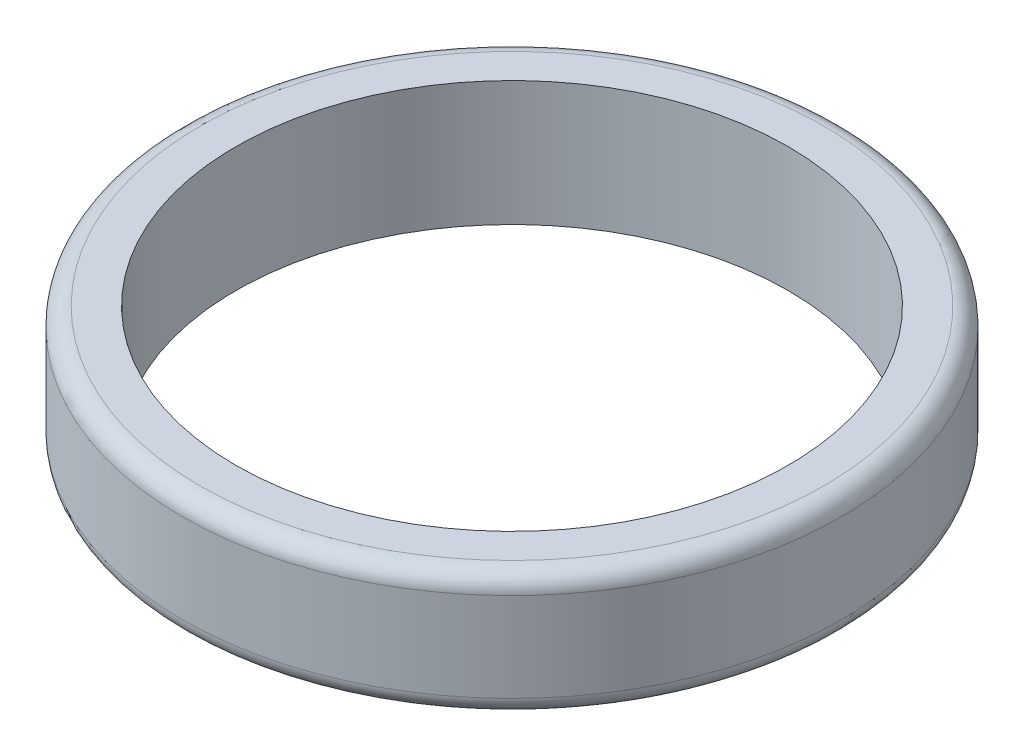
ISO-10303-21;
HEADER;
FILE_DESCRIPTION(('STEP AP214'),'2;1');
FILE_NAME('part.step','',(''),(''),'','','');
FILE_SCHEMA(('AUTOMOTIVE_DESIGN { 1 0 10303 214 1 1 1 1 }'));
ENDSEC;
DATA;
#1=APPLICATION_CONTEXT('core data for automotive mechanical design processes');
#2=APPLICATION_PROTOCOL_DEFINITION('international standard','automotive_design',2000,#1);
#3=PRODUCT_CONTEXT('',#1,'mechanical');
#4=PRODUCT('Part','Part','',(#3));
#5=PRODUCT_RELATED_PRODUCT_CATEGORY('part','',(#4));
#6=PRODUCT_DEFINITION_FORMATION('','',#4);
#7=PRODUCT_DEFINITION_CONTEXT('part definition',#1,'design');
#8=PRODUCT_DEFINITION('design','',#6,#7);
#9=PRODUCT_DEFINITION_SHAPE('','',#8);
#10=(LENGTH_UNIT() NAMED_UNIT(*) SI_UNIT(.MILLI.,.METRE.));
#11=(NAMED_UNIT(*) PLANE_ANGLE_UNIT() SI_UNIT($,.RADIAN.));
#12=(NAMED_UNIT(*) SI_UNIT($,.STERADIAN.) SOLID_ANGLE_UNIT());
#13=UNCERTAINTY_MEASURE_WITH_UNIT(LENGTH_MEASURE(1.E-05),#10,'distance_accuracy_value','');
#14=(GEOMETRIC_REPRESENTATION_CONTEXT(3) GLOBAL_UNCERTAINTY_ASSIGNED_CONTEXT((#13)) GLOBAL_UNIT_ASSIGNED_CONTEXT((#10,
#11,#12)) REPRESENTATION_CONTEXT('',''));
#15=CARTESIAN_POINT('',(0.,0.,0.));
#16=DIRECTION('',(0.,0.,1.));
#17=DIRECTION('',(1.,0.,0.));
#18=AXIS2_PLACEMENT_3D('',#15,#16,#17);
#19=CARTESIAN_POINT('',(0.,7.,0.));
#20=DIRECTION('',(0.,1.,0.));
#21=DIRECTION('',(0.,0.,1.));
#22=AXIS2_PLACEMENT_3D('',#19,#20,#21);
#23=PLANE('',#22);
#24=CARTESIAN_POINT('',(0.,7.,0.));
#25=DIRECTION('',(0.,1.,0.));
#26=DIRECTION('',(0.,0.,1.));
#27=AXIS2_PLACEMENT_3D('',#24,#25,#26);
#28=CIRCLE('',#27,17.5);
#29=CARTESIAN_POINT('',(0.,7.,17.5));
#30=VERTEX_POINT('',#29);
#31=EDGE_CURVE('E10',#30,#30,#28,.T.);
#32=ORIENTED_EDGE('',*,*,#31,.T.);
#33=EDGE_LOOP('',(#32));
#34=FACE_BOUND('',#33,.T.);
#35=CARTESIAN_POINT('',(0.,7.,0.));
#36=DIRECTION('',(0.,1.,0.));
#37=DIRECTION('',(0.,0.,1.));
#38=AXIS2_PLACEMENT_3D('',#35,#36,#37);
#39=CIRCLE('',#38,15.5);
#40=CARTESIAN_POINT('',(0.,7.,15.5));
#41=VERTEX_POINT('',#40);
#42=EDGE_CURVE('E51',#41,#41,#39,.T.);
#43=ORIENTED_EDGE('',*,*,#42,.F.);
#44=EDGE_LOOP('',(#43));
#45=FACE_BOUND('',#44,.T.);
#46=ADVANCED_FACE('F31',(#34,#45),#23,.T.);
#47=CARTESIAN_POINT('',(0.,0.,0.));
#48=DIRECTION('',(0.,1.,0.));
#49=DIRECTION('',(0.,0.,1.));
#50=AXIS2_PLACEMENT_3D('',#47,#48,#49);
#51=PLANE('',#50);
#52=CARTESIAN_POINT('',(0.,0.,0.));
#53=DIRECTION('',(0.,1.,0.));
#54=DIRECTION('',(0.,0.,1.));
#55=AXIS2_PLACEMENT_3D('',#52,#53,#54);
#56=CIRCLE('',#55,17.5);
#57=CARTESIAN_POINT('',(0.,0.,17.5));
#58=VERTEX_POINT('',#57);
#59=EDGE_CURVE('E38',#58,#58,#56,.F.);
#60=ORIENTED_EDGE('',*,*,#59,.T.);
#61=EDGE_LOOP('',(#60));
#62=FACE_BOUND('',#61,.T.);
#63=CARTESIAN_POINT('',(0.,0.,0.));
#64=DIRECTION('',(0.,1.,0.));
#65=DIRECTION('',(0.,0.,1.));
#66=AXIS2_PLACEMENT_3D('',#63,#64,#65);
#67=CIRCLE('',#66,15.5);
#68=CARTESIAN_POINT('',(0.,0.,15.5));
#69=VERTEX_POINT('',#68);
#70=EDGE_CURVE('E52',#69,#69,#67,.T.);
#71=ORIENTED_EDGE('',*,*,#70,.T.);
#72=EDGE_LOOP('',(#71));
#73=FACE_BOUND('',#72,.T.);
#74=ADVANCED_FACE('F62',(#62,#73),#51,.F.);
#75=CARTESIAN_POINT('',(0.,7.,0.));
#76=DIRECTION('',(0.,-1.,0.));
#77=DIRECTION('',(0.,0.,-1.));
#78=AXIS2_PLACEMENT_3D('',#75,#76,#77);
#79=CYLINDRICAL_SURFACE('',#78,18.5);
#80=CARTESIAN_POINT('',(0.,1.,0.));
#81=DIRECTION('',(0.,1.,0.));
#82=DIRECTION('',(0.,0.,1.));
#83=AXIS2_PLACEMENT_3D('',#80,#81,#82);
#84=CIRCLE('',#83,18.5);
#85=CARTESIAN_POINT('',(0.,1.,18.5));
#86=VERTEX_POINT('',#85);
#87=EDGE_CURVE('E42',#86,#86,#84,.T.);
#88=ORIENTED_EDGE('',*,*,#87,.T.);
#89=EDGE_LOOP('',(#88));
#90=FACE_BOUND('',#89,.T.);
#91=CARTESIAN_POINT('',(0.,6.,0.));
#92=DIRECTION('',(0.,1.,0.));
#93=DIRECTION('',(0.,0.,1.));
#94=AXIS2_PLACEMENT_3D('',#91,#92,#93);
#95=CIRCLE('',#94,18.5);
#96=CARTESIAN_POINT('',(0.,6.,18.5));
#97=VERTEX_POINT('',#96);
#98=EDGE_CURVE('E46',#97,#97,#95,.F.);
#99=ORIENTED_EDGE('',*,*,#98,.T.);
#100=EDGE_LOOP('',(#99));
#101=FACE_BOUND('',#100,.T.);
#102=ADVANCED_FACE('F67',(#90,#101),#79,.T.);
#103=CARTESIAN_POINT('',(0.,7.,0.));
#104=DIRECTION('',(0.,-1.,0.));
#105=DIRECTION('',(0.,0.,-1.));
#106=AXIS2_PLACEMENT_3D('',#103,#104,#105);
#107=CYLINDRICAL_SURFACE('',#106,15.5);
#108=ORIENTED_EDGE('',*,*,#42,.T.);
#109=EDGE_LOOP('',(#108));
#110=FACE_BOUND('',#109,.T.);
#111=ORIENTED_EDGE('',*,*,#70,.F.);
#112=EDGE_LOOP('',(#111));
#113=FACE_BOUND('',#112,.T.);
#114=ADVANCED_FACE('F58',(#110,#113),#107,.F.);
#115=CARTESIAN_POINT('',(0.,1.,0.));
#116=DIRECTION('',(0.,1.,0.));
#117=DIRECTION('',(0.,0.,1.));
#118=AXIS2_PLACEMENT_3D('',#115,#116,#117);
#119=TOROIDAL_SURFACE('',#118,17.5,1.);
#120=ORIENTED_EDGE('',*,*,#59,.F.);
#121=EDGE_LOOP('',(#120));
#122=FACE_BOUND('',#121,.T.);
#123=ORIENTED_EDGE('',*,*,#87,.F.);
#124=EDGE_LOOP('',(#123));
#125=FACE_BOUND('',#124,.T.);
#126=ADVANCED_FACE('F73',(#122,#125),#119,.T.);
#127=CARTESIAN_POINT('',(0.,6.,0.));
#128=DIRECTION('',(0.,1.,0.));
#129=DIRECTION('',(0.,0.,1.));
#130=AXIS2_PLACEMENT_3D('',#127,#128,#129);
#131=TOROIDAL_SURFACE('',#130,17.5,1.);
#132=ORIENTED_EDGE('',*,*,#98,.F.);
#133=EDGE_LOOP('',(#132));
#134=FACE_BOUND('',#133,.T.);
#135=ORIENTED_EDGE('',*,*,#31,.F.);
#136=EDGE_LOOP('',(#135));
#137=FACE_BOUND('',#136,.T.);
#138=ADVANCED_FACE('F33',(#134,#137),#131,.T.);
#139=CLOSED_SHELL('',(#46,#74,#102,#114,#126,#138));
#140=MANIFOLD_SOLID_BREP('B2',#139);
#141=ADVANCED_BREP_SHAPE_REPRESENTATION('',(#18,#140),#14);
#142=SHAPE_DEFINITION_REPRESENTATION(#9,#141);
ENDSEC;
END-ISO-10303-21;
